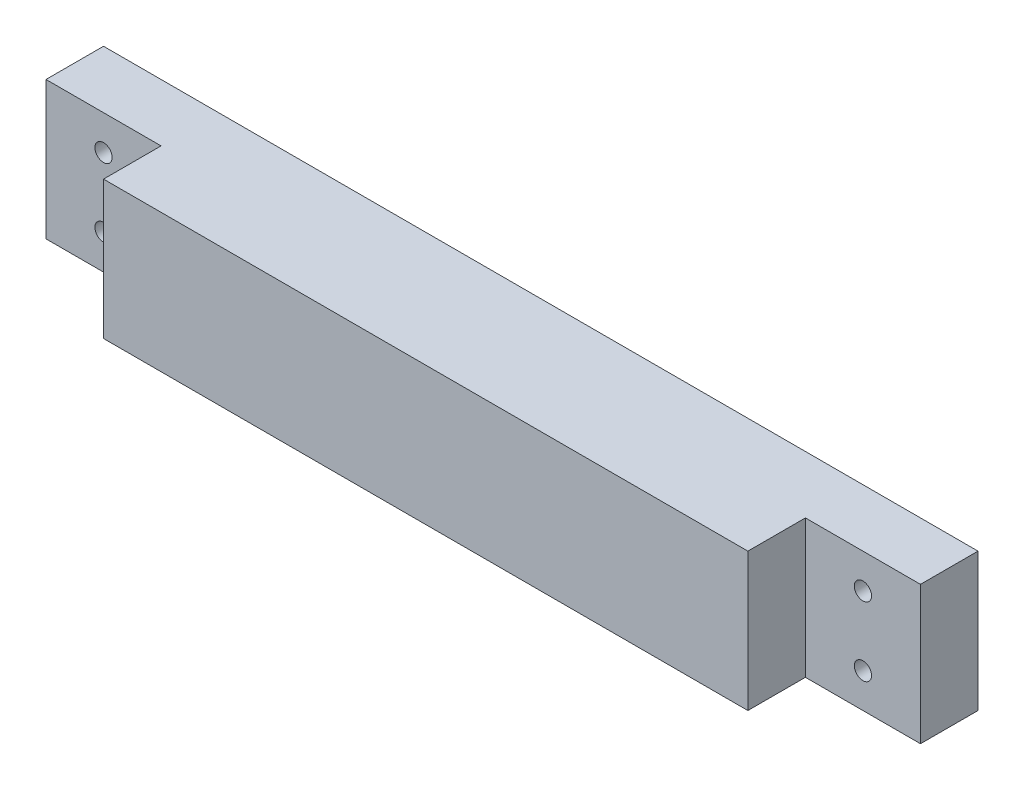
ISO-10303-21;
HEADER;
FILE_DESCRIPTION(('STEP AP214'),'2;1');
FILE_NAME('part.step','',(''),(''),'','','');
FILE_SCHEMA(('AUTOMOTIVE_DESIGN { 1 0 10303 214 1 1 1 1 }'));
ENDSEC;
DATA;
#1=APPLICATION_CONTEXT('core data for automotive mechanical design processes');
#2=APPLICATION_PROTOCOL_DEFINITION('international standard','automotive_design',2000,#1);
#3=PRODUCT_CONTEXT('',#1,'mechanical');
#4=PRODUCT('Part','Part','',(#3));
#5=PRODUCT_RELATED_PRODUCT_CATEGORY('part','',(#4));
#6=PRODUCT_DEFINITION_FORMATION('','',#4);
#7=PRODUCT_DEFINITION_CONTEXT('part definition',#1,'design');
#8=PRODUCT_DEFINITION('design','',#6,#7);
#9=PRODUCT_DEFINITION_SHAPE('','',#8);
#10=(LENGTH_UNIT() NAMED_UNIT(*) SI_UNIT(.MILLI.,.METRE.));
#11=(NAMED_UNIT(*) PLANE_ANGLE_UNIT() SI_UNIT($,.RADIAN.));
#12=(NAMED_UNIT(*) SI_UNIT($,.STERADIAN.) SOLID_ANGLE_UNIT());
#13=UNCERTAINTY_MEASURE_WITH_UNIT(LENGTH_MEASURE(1.E-05),#10,'distance_accuracy_value','');
#14=(GEOMETRIC_REPRESENTATION_CONTEXT(3) GLOBAL_UNCERTAINTY_ASSIGNED_CONTEXT((#13)) GLOBAL_UNIT_ASSIGNED_CONTEXT((#10,
#11,#12)) REPRESENTATION_CONTEXT('',''));
#15=CARTESIAN_POINT('',(0.,0.,0.));
#16=DIRECTION('',(0.,0.,1.));
#17=DIRECTION('',(1.,0.,0.));
#18=AXIS2_PLACEMENT_3D('',#15,#16,#17);
#19=CARTESIAN_POINT('',(0.,0.,31.75));
#20=DIRECTION('',(0.,0.,-1.));
#21=DIRECTION('',(-1.,0.,0.));
#22=AXIS2_PLACEMENT_3D('',#19,#20,#21);
#23=PLANE('',#22);
#24=CARTESIAN_POINT('',(-209.55,-19.05,31.75));
#25=DIRECTION('',(0.,0.,1.));
#26=DIRECTION('',(1.,0.,0.));
#27=AXIS2_PLACEMENT_3D('',#24,#25,#26);
#28=CIRCLE('',#27,4.76250000000001);
#29=CARTESIAN_POINT('',(-204.7875,-19.05,31.75));
#30=VERTEX_POINT('',#29);
#31=EDGE_CURVE('E181',#30,#30,#28,.T.);
#32=ORIENTED_EDGE('',*,*,#31,.F.);
#33=EDGE_LOOP('',(#32));
#34=FACE_BOUND('',#33,.T.);
#35=CARTESIAN_POINT('',(-209.55,19.05,31.75));
#36=DIRECTION('',(0.,0.,1.));
#37=DIRECTION('',(1.,0.,0.));
#38=AXIS2_PLACEMENT_3D('',#35,#36,#37);
#39=CIRCLE('',#38,4.76250000000001);
#40=CARTESIAN_POINT('',(-204.7875,19.05,31.75));
#41=VERTEX_POINT('',#40);
#42=EDGE_CURVE('E175',#41,#41,#39,.T.);
#43=ORIENTED_EDGE('',*,*,#42,.F.);
#44=EDGE_LOOP('',(#43));
#45=FACE_BOUND('',#44,.T.);
#46=DIRECTION('',(0.,-1.,0.));
#47=VECTOR('',#46,1.);
#48=CARTESIAN_POINT('',(-177.8,38.1,31.75));
#49=LINE('',#48,#47);
#50=CARTESIAN_POINT('',(-177.8,38.1,31.75));
#51=VERTEX_POINT('',#50);
#52=CARTESIAN_POINT('',(-177.8,-38.1,31.75));
#53=VERTEX_POINT('',#52);
#54=EDGE_CURVE('E47',#51,#53,#49,.T.);
#55=ORIENTED_EDGE('',*,*,#54,.F.);
#56=DIRECTION('',(-1.,0.,0.));
#57=VECTOR('',#56,1.);
#58=CARTESIAN_POINT('',(241.3,38.1,31.75));
#59=LINE('',#58,#57);
#60=CARTESIAN_POINT('',(-241.3,38.1,31.75));
#61=VERTEX_POINT('',#60);
#62=EDGE_CURVE('E136',#51,#61,#59,.T.);
#63=ORIENTED_EDGE('',*,*,#62,.T.);
#64=DIRECTION('',(0.,-1.,0.));
#65=VECTOR('',#64,1.);
#66=CARTESIAN_POINT('',(-241.3,38.1,31.75));
#67=LINE('',#66,#65);
#68=CARTESIAN_POINT('',(-241.3,-38.1,31.75));
#69=VERTEX_POINT('',#68);
#70=EDGE_CURVE('E127',#61,#69,#67,.T.);
#71=ORIENTED_EDGE('',*,*,#70,.T.);
#72=DIRECTION('',(1.,0.,0.));
#73=VECTOR('',#72,1.);
#74=CARTESIAN_POINT('',(241.3,-38.1,31.75));
#75=LINE('',#74,#73);
#76=EDGE_CURVE('E132',#69,#53,#75,.T.);
#77=ORIENTED_EDGE('',*,*,#76,.T.);
#78=EDGE_LOOP('',(#55,#63,#71,#77));
#79=FACE_BOUND('',#78,.T.);
#80=ADVANCED_FACE('F32',(#34,#45,#79),#23,.F.);
#81=CARTESIAN_POINT('',(209.55,-19.05,31.75));
#82=DIRECTION('',(0.,0.,-1.));
#83=DIRECTION('',(-1.,0.,0.));
#84=AXIS2_PLACEMENT_3D('',#81,#82,#83);
#85=CIRCLE('',#84,4.76250000000001);
#86=CARTESIAN_POINT('',(204.7875,-19.05,31.75));
#87=VERTEX_POINT('',#86);
#88=EDGE_CURVE('E193',#87,#87,#85,.T.);
#89=ORIENTED_EDGE('',*,*,#88,.T.);
#90=EDGE_LOOP('',(#89));
#91=FACE_BOUND('',#90,.T.);
#92=CARTESIAN_POINT('',(209.55,19.05,31.75));
#93=DIRECTION('',(0.,0.,-1.));
#94=DIRECTION('',(-1.,0.,0.));
#95=AXIS2_PLACEMENT_3D('',#92,#93,#94);
#96=CIRCLE('',#95,4.76250000000001);
#97=CARTESIAN_POINT('',(204.7875,19.05,31.75));
#98=VERTEX_POINT('',#97);
#99=EDGE_CURVE('E187',#98,#98,#96,.T.);
#100=ORIENTED_EDGE('',*,*,#99,.T.);
#101=EDGE_LOOP('',(#100));
#102=FACE_BOUND('',#101,.T.);
#103=DIRECTION('',(0.,1.,0.));
#104=VECTOR('',#103,1.);
#105=CARTESIAN_POINT('',(177.8,38.1,31.75));
#106=LINE('',#105,#104);
#107=CARTESIAN_POINT('',(177.8,-38.1,31.75));
#108=VERTEX_POINT('',#107);
#109=CARTESIAN_POINT('',(177.8,38.1,31.75));
#110=VERTEX_POINT('',#109);
#111=EDGE_CURVE('E55',#108,#110,#106,.T.);
#112=ORIENTED_EDGE('',*,*,#111,.F.);
#113=CARTESIAN_POINT('',(241.3,-38.1,31.75));
#114=VERTEX_POINT('',#113);
#115=EDGE_CURVE('E130',#108,#114,#75,.T.);
#116=ORIENTED_EDGE('',*,*,#115,.T.);
#117=DIRECTION('',(0.,1.,0.));
#118=VECTOR('',#117,1.);
#119=CARTESIAN_POINT('',(241.3,38.1,31.75));
#120=LINE('',#119,#118);
#121=CARTESIAN_POINT('',(241.3,38.1,31.75));
#122=VERTEX_POINT('',#121);
#123=EDGE_CURVE('E134',#114,#122,#120,.T.);
#124=ORIENTED_EDGE('',*,*,#123,.T.);
#125=EDGE_CURVE('E137',#122,#110,#59,.T.);
#126=ORIENTED_EDGE('',*,*,#125,.T.);
#127=EDGE_LOOP('',(#112,#116,#124,#126));
#128=FACE_BOUND('',#127,.T.);
#129=ADVANCED_FACE('F219',(#91,#102,#128),#23,.F.);
#130=CARTESIAN_POINT('',(-241.3,38.1,31.75));
#131=DIRECTION('',(1.,0.,0.));
#132=DIRECTION('',(0.,1.,0.));
#133=AXIS2_PLACEMENT_3D('',#130,#131,#132);
#134=PLANE('',#133);
#135=DIRECTION('',(0.,-1.,0.));
#136=VECTOR('',#135,1.);
#137=CARTESIAN_POINT('',(-241.3,38.1,0.));
#138=LINE('',#137,#136);
#139=CARTESIAN_POINT('',(-241.3,38.1,0.));
#140=VERTEX_POINT('',#139);
#141=CARTESIAN_POINT('',(-241.3,-38.1,0.));
#142=VERTEX_POINT('',#141);
#143=EDGE_CURVE('E118',#140,#142,#138,.T.);
#144=ORIENTED_EDGE('',*,*,#143,.T.);
#145=DIRECTION('',(0.,0.,-1.));
#146=VECTOR('',#145,1.);
#147=CARTESIAN_POINT('',(-241.3,-38.1,31.75));
#148=LINE('',#147,#146);
#149=EDGE_CURVE('E11',#69,#142,#148,.T.);
#150=ORIENTED_EDGE('',*,*,#149,.F.);
#151=ORIENTED_EDGE('',*,*,#70,.F.);
#152=DIRECTION('',(0.,0.,-1.));
#153=VECTOR('',#152,1.);
#154=CARTESIAN_POINT('',(-241.3,38.1,31.75));
#155=LINE('',#154,#153);
#156=EDGE_CURVE('E138',#61,#140,#155,.T.);
#157=ORIENTED_EDGE('',*,*,#156,.T.);
#158=EDGE_LOOP('',(#144,#150,#151,#157));
#159=FACE_BOUND('',#158,.T.);
#160=ADVANCED_FACE('F34',(#159),#134,.F.);
#161=CARTESIAN_POINT('',(241.3,-38.1,31.75));
#162=DIRECTION('',(0.,1.,0.));
#163=DIRECTION('',(-1.,0.,0.));
#164=AXIS2_PLACEMENT_3D('',#161,#162,#163);
#165=PLANE('',#164);
#166=DIRECTION('',(1.,0.,0.));
#167=VECTOR('',#166,1.);
#168=CARTESIAN_POINT('',(241.3,-38.1,0.));
#169=LINE('',#168,#167);
#170=CARTESIAN_POINT('',(241.3,-38.1,0.));
#171=VERTEX_POINT('',#170);
#172=EDGE_CURVE('E121',#142,#171,#169,.T.);
#173=ORIENTED_EDGE('',*,*,#172,.T.);
#174=DIRECTION('',(0.,0.,-1.));
#175=VECTOR('',#174,1.);
#176=CARTESIAN_POINT('',(241.3,-38.1,31.75));
#177=LINE('',#176,#175);
#178=EDGE_CURVE('E40',#114,#171,#177,.T.);
#179=ORIENTED_EDGE('',*,*,#178,.F.);
#180=ORIENTED_EDGE('',*,*,#115,.F.);
#181=DIRECTION('',(0.,0.,-1.));
#182=VECTOR('',#181,1.);
#183=CARTESIAN_POINT('',(177.8,-38.1,63.5));
#184=LINE('',#183,#182);
#185=CARTESIAN_POINT('',(177.8,-38.1,63.5));
#186=VERTEX_POINT('',#185);
#187=EDGE_CURVE('E103',#186,#108,#184,.T.);
#188=ORIENTED_EDGE('',*,*,#187,.F.);
#189=DIRECTION('',(1.,0.,0.));
#190=VECTOR('',#189,1.);
#191=CARTESIAN_POINT('',(177.8,-38.1,63.5));
#192=LINE('',#191,#190);
#193=CARTESIAN_POINT('',(-177.8,-38.1000000000001,63.5));
#194=VERTEX_POINT('',#193);
#195=EDGE_CURVE('E97',#194,#186,#192,.T.);
#196=ORIENTED_EDGE('',*,*,#195,.F.);
#197=DIRECTION('',(0.,0.,-1.));
#198=VECTOR('',#197,1.);
#199=CARTESIAN_POINT('',(-177.8,-38.1000000000001,63.5));
#200=LINE('',#199,#198);
#201=EDGE_CURVE('E101',#194,#53,#200,.T.);
#202=ORIENTED_EDGE('',*,*,#201,.T.);
#203=ORIENTED_EDGE('',*,*,#76,.F.);
#204=ORIENTED_EDGE('',*,*,#149,.T.);
#205=EDGE_LOOP('',(#173,#179,#180,#188,#196,#202,#203,#204));
#206=FACE_BOUND('',#205,.T.);
#207=ADVANCED_FACE('F99',(#206),#165,.F.);
#208=CARTESIAN_POINT('',(241.3,38.1,31.75));
#209=DIRECTION('',(-1.,0.,0.));
#210=DIRECTION('',(0.,0.,1.));
#211=AXIS2_PLACEMENT_3D('',#208,#209,#210);
#212=PLANE('',#211);
#213=DIRECTION('',(0.,1.,0.));
#214=VECTOR('',#213,1.);
#215=CARTESIAN_POINT('',(241.3,38.1,0.));
#216=LINE('',#215,#214);
#217=CARTESIAN_POINT('',(241.3,38.1,0.));
#218=VERTEX_POINT('',#217);
#219=EDGE_CURVE('E141',#171,#218,#216,.T.);
#220=ORIENTED_EDGE('',*,*,#219,.T.);
#221=DIRECTION('',(0.,0.,-1.));
#222=VECTOR('',#221,1.);
#223=CARTESIAN_POINT('',(241.3,38.1,31.75));
#224=LINE('',#223,#222);
#225=EDGE_CURVE('E146',#122,#218,#224,.T.);
#226=ORIENTED_EDGE('',*,*,#225,.F.);
#227=ORIENTED_EDGE('',*,*,#123,.F.);
#228=ORIENTED_EDGE('',*,*,#178,.T.);
#229=EDGE_LOOP('',(#220,#226,#227,#228));
#230=FACE_BOUND('',#229,.T.);
#231=ADVANCED_FACE('F153',(#230),#212,.F.);
#232=CARTESIAN_POINT('',(241.3,38.1,31.75));
#233=DIRECTION('',(0.,-1.,0.));
#234=DIRECTION('',(1.,0.,0.));
#235=AXIS2_PLACEMENT_3D('',#232,#233,#234);
#236=PLANE('',#235);
#237=DIRECTION('',(-1.,0.,0.));
#238=VECTOR('',#237,1.);
#239=CARTESIAN_POINT('',(241.3,38.1,0.));
#240=LINE('',#239,#238);
#241=EDGE_CURVE('E131',#218,#140,#240,.T.);
#242=ORIENTED_EDGE('',*,*,#241,.T.);
#243=ORIENTED_EDGE('',*,*,#156,.F.);
#244=ORIENTED_EDGE('',*,*,#62,.F.);
#245=DIRECTION('',(0.,0.,-1.));
#246=VECTOR('',#245,1.);
#247=CARTESIAN_POINT('',(-177.8,38.1,63.5));
#248=LINE('',#247,#246);
#249=CARTESIAN_POINT('',(-177.8,38.1,63.5));
#250=VERTEX_POINT('',#249);
#251=EDGE_CURVE('E166',#250,#51,#248,.T.);
#252=ORIENTED_EDGE('',*,*,#251,.F.);
#253=DIRECTION('',(-1.,0.,0.));
#254=VECTOR('',#253,1.);
#255=CARTESIAN_POINT('',(177.8,38.1,63.5));
#256=LINE('',#255,#254);
#257=CARTESIAN_POINT('',(177.8,38.1,63.5));
#258=VERTEX_POINT('',#257);
#259=EDGE_CURVE('E112',#258,#250,#256,.T.);
#260=ORIENTED_EDGE('',*,*,#259,.F.);
#261=DIRECTION('',(0.,0.,-1.));
#262=VECTOR('',#261,1.);
#263=CARTESIAN_POINT('',(177.8,38.1,63.5));
#264=LINE('',#263,#262);
#265=EDGE_CURVE('E123',#258,#110,#264,.T.);
#266=ORIENTED_EDGE('',*,*,#265,.T.);
#267=ORIENTED_EDGE('',*,*,#125,.F.);
#268=ORIENTED_EDGE('',*,*,#225,.T.);
#269=EDGE_LOOP('',(#242,#243,#244,#252,#260,#266,#267,#268));
#270=FACE_BOUND('',#269,.T.);
#271=ADVANCED_FACE('F161',(#270),#236,.F.);
#272=CARTESIAN_POINT('',(0.,0.,0.));
#273=DIRECTION('',(0.,0.,-1.));
#274=DIRECTION('',(-1.,0.,0.));
#275=AXIS2_PLACEMENT_3D('',#272,#273,#274);
#276=PLANE('',#275);
#277=CARTESIAN_POINT('',(209.55,-19.05,0.));
#278=DIRECTION('',(0.,0.,-1.));
#279=DIRECTION('',(-1.,0.,0.));
#280=AXIS2_PLACEMENT_3D('',#277,#278,#279);
#281=CIRCLE('',#280,4.76250000000001);
#282=CARTESIAN_POINT('',(204.7875,-19.05,0.));
#283=VERTEX_POINT('',#282);
#284=EDGE_CURVE('E190',#283,#283,#281,.T.);
#285=ORIENTED_EDGE('',*,*,#284,.F.);
#286=EDGE_LOOP('',(#285));
#287=FACE_BOUND('',#286,.T.);
#288=CARTESIAN_POINT('',(209.55,19.05,0.));
#289=DIRECTION('',(0.,0.,-1.));
#290=DIRECTION('',(-1.,0.,0.));
#291=AXIS2_PLACEMENT_3D('',#288,#289,#290);
#292=CIRCLE('',#291,4.76250000000001);
#293=CARTESIAN_POINT('',(204.7875,19.05,0.));
#294=VERTEX_POINT('',#293);
#295=EDGE_CURVE('E184',#294,#294,#292,.T.);
#296=ORIENTED_EDGE('',*,*,#295,.F.);
#297=EDGE_LOOP('',(#296));
#298=FACE_BOUND('',#297,.T.);
#299=CARTESIAN_POINT('',(-209.55,-19.05,0.));
#300=DIRECTION('',(0.,0.,1.));
#301=DIRECTION('',(1.,0.,0.));
#302=AXIS2_PLACEMENT_3D('',#299,#300,#301);
#303=CIRCLE('',#302,4.76250000000001);
#304=CARTESIAN_POINT('',(-204.7875,-19.05,0.));
#305=VERTEX_POINT('',#304);
#306=EDGE_CURVE('E178',#305,#305,#303,.T.);
#307=ORIENTED_EDGE('',*,*,#306,.T.);
#308=EDGE_LOOP('',(#307));
#309=FACE_BOUND('',#308,.T.);
#310=CARTESIAN_POINT('',(-209.55,19.05,0.));
#311=DIRECTION('',(0.,0.,1.));
#312=DIRECTION('',(1.,0.,0.));
#313=AXIS2_PLACEMENT_3D('',#310,#311,#312);
#314=CIRCLE('',#313,4.76250000000001);
#315=CARTESIAN_POINT('',(-204.7875,19.05,0.));
#316=VERTEX_POINT('',#315);
#317=EDGE_CURVE('E172',#316,#316,#314,.T.);
#318=ORIENTED_EDGE('',*,*,#317,.T.);
#319=EDGE_LOOP('',(#318));
#320=FACE_BOUND('',#319,.T.);
#321=ORIENTED_EDGE('',*,*,#143,.F.);
#322=ORIENTED_EDGE('',*,*,#241,.F.);
#323=ORIENTED_EDGE('',*,*,#219,.F.);
#324=ORIENTED_EDGE('',*,*,#172,.F.);
#325=EDGE_LOOP('',(#321,#322,#323,#324));
#326=FACE_BOUND('',#325,.T.);
#327=ADVANCED_FACE('F158',(#287,#298,#309,#320,#326),#276,.T.);
#328=CARTESIAN_POINT('',(-177.8,38.1,63.5));
#329=DIRECTION('',(1.,0.,0.));
#330=DIRECTION('',(0.,0.,-1.));
#331=AXIS2_PLACEMENT_3D('',#328,#329,#330);
#332=PLANE('',#331);
#333=ORIENTED_EDGE('',*,*,#54,.T.);
#334=ORIENTED_EDGE('',*,*,#201,.F.);
#335=DIRECTION('',(0.,-1.,0.));
#336=VECTOR('',#335,1.);
#337=CARTESIAN_POINT('',(-177.8,38.1,63.5));
#338=LINE('',#337,#336);
#339=EDGE_CURVE('E107',#250,#194,#338,.T.);
#340=ORIENTED_EDGE('',*,*,#339,.F.);
#341=ORIENTED_EDGE('',*,*,#251,.T.);
#342=EDGE_LOOP('',(#333,#334,#340,#341));
#343=FACE_BOUND('',#342,.T.);
#344=ADVANCED_FACE('F117',(#343),#332,.F.);
#345=CARTESIAN_POINT('',(177.8,38.1,63.5));
#346=DIRECTION('',(-1.,0.,0.));
#347=DIRECTION('',(0.,0.,1.));
#348=AXIS2_PLACEMENT_3D('',#345,#346,#347);
#349=PLANE('',#348);
#350=ORIENTED_EDGE('',*,*,#111,.T.);
#351=ORIENTED_EDGE('',*,*,#265,.F.);
#352=DIRECTION('',(0.,1.,0.));
#353=VECTOR('',#352,1.);
#354=CARTESIAN_POINT('',(177.8,38.1,63.5));
#355=LINE('',#354,#353);
#356=EDGE_CURVE('E106',#186,#258,#355,.T.);
#357=ORIENTED_EDGE('',*,*,#356,.F.);
#358=ORIENTED_EDGE('',*,*,#187,.T.);
#359=EDGE_LOOP('',(#350,#351,#357,#358));
#360=FACE_BOUND('',#359,.T.);
#361=ADVANCED_FACE('F284',(#360),#349,.F.);
#362=CARTESIAN_POINT('',(0.,0.,63.5));
#363=DIRECTION('',(0.,0.,-1.));
#364=DIRECTION('',(-1.,0.,0.));
#365=AXIS2_PLACEMENT_3D('',#362,#363,#364);
#366=PLANE('',#365);
#367=ORIENTED_EDGE('',*,*,#339,.T.);
#368=ORIENTED_EDGE('',*,*,#195,.T.);
#369=ORIENTED_EDGE('',*,*,#356,.T.);
#370=ORIENTED_EDGE('',*,*,#259,.T.);
#371=EDGE_LOOP('',(#367,#368,#369,#370));
#372=FACE_BOUND('',#371,.T.);
#373=ADVANCED_FACE('F110',(#372),#366,.F.);
#374=CARTESIAN_POINT('',(-209.55,19.05,0.));
#375=DIRECTION('',(0.,0.,1.));
#376=DIRECTION('',(1.,0.,0.));
#377=AXIS2_PLACEMENT_3D('',#374,#375,#376);
#378=CYLINDRICAL_SURFACE('',#377,4.76250000000001);
#379=ORIENTED_EDGE('',*,*,#317,.F.);
#380=EDGE_LOOP('',(#379));
#381=FACE_BOUND('',#380,.T.);
#382=ORIENTED_EDGE('',*,*,#42,.T.);
#383=EDGE_LOOP('',(#382));
#384=FACE_BOUND('',#383,.T.);
#385=ADVANCED_FACE('F211',(#381,#384),#378,.F.);
#386=CARTESIAN_POINT('',(-209.55,-19.05,0.));
#387=DIRECTION('',(0.,0.,1.));
#388=DIRECTION('',(1.,0.,0.));
#389=AXIS2_PLACEMENT_3D('',#386,#387,#388);
#390=CYLINDRICAL_SURFACE('',#389,4.76250000000001);
#391=ORIENTED_EDGE('',*,*,#306,.F.);
#392=EDGE_LOOP('',(#391));
#393=FACE_BOUND('',#392,.T.);
#394=ORIENTED_EDGE('',*,*,#31,.T.);
#395=EDGE_LOOP('',(#394));
#396=FACE_BOUND('',#395,.T.);
#397=ADVANCED_FACE('F214',(#393,#396),#390,.F.);
#398=CARTESIAN_POINT('',(209.55,19.05,0.));
#399=DIRECTION('',(0.,0.,1.));
#400=DIRECTION('',(1.,0.,0.));
#401=AXIS2_PLACEMENT_3D('',#398,#399,#400);
#402=CYLINDRICAL_SURFACE('',#401,4.76250000000001);
#403=ORIENTED_EDGE('',*,*,#295,.T.);
#404=EDGE_LOOP('',(#403));
#405=FACE_BOUND('',#404,.T.);
#406=ORIENTED_EDGE('',*,*,#99,.F.);
#407=EDGE_LOOP('',(#406));
#408=FACE_BOUND('',#407,.T.);
#409=ADVANCED_FACE('F263',(#405,#408),#402,.F.);
#410=CARTESIAN_POINT('',(209.55,-19.05,0.));
#411=DIRECTION('',(0.,0.,1.));
#412=DIRECTION('',(1.,0.,0.));
#413=AXIS2_PLACEMENT_3D('',#410,#411,#412);
#414=CYLINDRICAL_SURFACE('',#413,4.76250000000001);
#415=ORIENTED_EDGE('',*,*,#284,.T.);
#416=EDGE_LOOP('',(#415));
#417=FACE_BOUND('',#416,.T.);
#418=ORIENTED_EDGE('',*,*,#88,.F.);
#419=EDGE_LOOP('',(#418));
#420=FACE_BOUND('',#419,.T.);
#421=ADVANCED_FACE('F199',(#417,#420),#414,.F.);
#422=CLOSED_SHELL('',(#80,#129,#160,#207,#231,#271,#327,#344,#361,#373,#385,#397,#409,#421));
#423=MANIFOLD_SOLID_BREP('B2',#422);
#424=ADVANCED_BREP_SHAPE_REPRESENTATION('',(#18,#423),#14);
#425=SHAPE_DEFINITION_REPRESENTATION(#9,#424);
ENDSEC;
END-ISO-10303-21;
